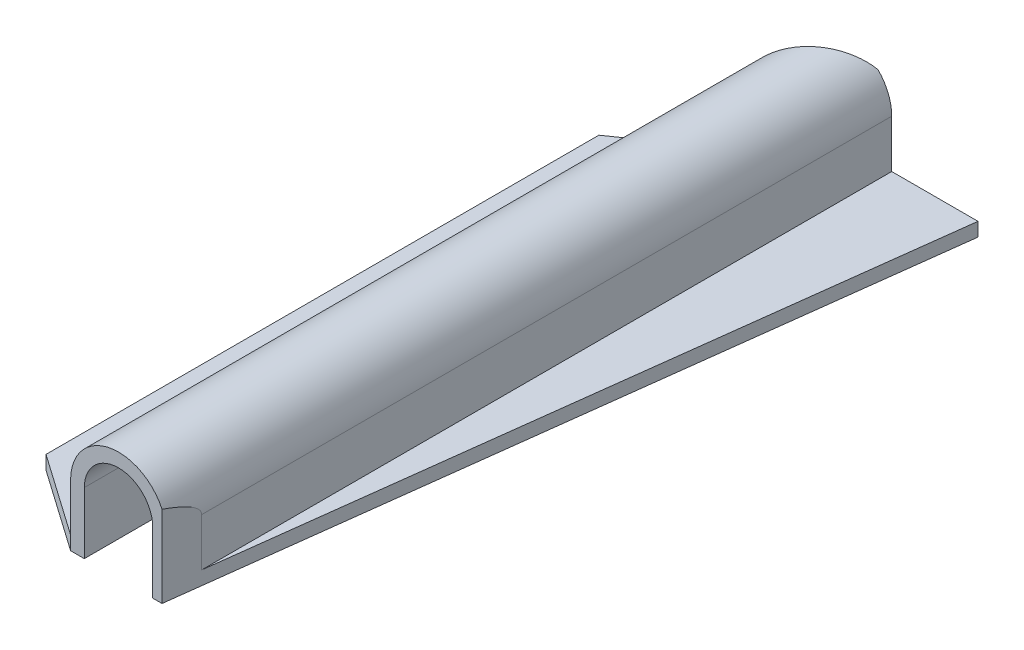
ISO-10303-21;
HEADER;
FILE_DESCRIPTION(('STEP AP214'),'2;1');
FILE_NAME('part.step','',(''),(''),'','','');
FILE_SCHEMA(('AUTOMOTIVE_DESIGN { 1 0 10303 214 1 1 1 1 }'));
ENDSEC;
DATA;
#1=APPLICATION_CONTEXT('core data for automotive mechanical design processes');
#2=APPLICATION_PROTOCOL_DEFINITION('international standard','automotive_design',2000,#1);
#3=PRODUCT_CONTEXT('',#1,'mechanical');
#4=PRODUCT('Part','Part','',(#3));
#5=PRODUCT_RELATED_PRODUCT_CATEGORY('part','',(#4));
#6=PRODUCT_DEFINITION_FORMATION('','',#4);
#7=PRODUCT_DEFINITION_CONTEXT('part definition',#1,'design');
#8=PRODUCT_DEFINITION('design','',#6,#7);
#9=PRODUCT_DEFINITION_SHAPE('','',#8);
#10=(LENGTH_UNIT() NAMED_UNIT(*) SI_UNIT(.MILLI.,.METRE.));
#11=(NAMED_UNIT(*) PLANE_ANGLE_UNIT() SI_UNIT($,.RADIAN.));
#12=(NAMED_UNIT(*) SI_UNIT($,.STERADIAN.) SOLID_ANGLE_UNIT());
#13=UNCERTAINTY_MEASURE_WITH_UNIT(LENGTH_MEASURE(1.E-05),#10,'distance_accuracy_value','');
#14=(GEOMETRIC_REPRESENTATION_CONTEXT(3) GLOBAL_UNCERTAINTY_ASSIGNED_CONTEXT((#13)) GLOBAL_UNIT_ASSIGNED_CONTEXT((#10,
#11,#12)) REPRESENTATION_CONTEXT('',''));
#15=CARTESIAN_POINT('',(0.,0.,0.));
#16=DIRECTION('',(0.,0.,1.));
#17=DIRECTION('',(1.,0.,0.));
#18=AXIS2_PLACEMENT_3D('',#15,#16,#17);
#19=CARTESIAN_POINT('',(0.,4.5,53.));
#20=DIRECTION('',(0.,0.,1.));
#21=DIRECTION('',(1.,0.,0.));
#22=AXIS2_PLACEMENT_3D('',#19,#20,#21);
#23=PLANE('',#22);
#24=DIRECTION('',(0.,1.,0.));
#25=VECTOR('',#24,1.);
#26=CARTESIAN_POINT('',(-3.5,0.,53.));
#27=LINE('',#26,#25);
#28=CARTESIAN_POINT('',(-3.5,1.,53.));
#29=VERTEX_POINT('',#28);
#30=CARTESIAN_POINT('',(-3.5,4.5,53.));
#31=VERTEX_POINT('',#30);
#32=EDGE_CURVE('E142',#29,#31,#27,.T.);
#33=ORIENTED_EDGE('',*,*,#32,.F.);
#34=DIRECTION('',(0.,-1.,0.));
#35=VECTOR('',#34,1.);
#36=CARTESIAN_POINT('',(-3.5,8.,53.));
#37=LINE('',#36,#35);
#38=CARTESIAN_POINT('',(-3.5,0.,53.));
#39=VERTEX_POINT('',#38);
#40=EDGE_CURVE('E129',#29,#39,#37,.T.);
#41=ORIENTED_EDGE('',*,*,#40,.T.);
#42=DIRECTION('',(1.,0.,0.));
#43=VECTOR('',#42,1.);
#44=CARTESIAN_POINT('',(-9.5,0.,53.));
#45=LINE('',#44,#43);
#46=CARTESIAN_POINT('',(-2.5,0.,53.));
#47=VERTEX_POINT('',#46);
#48=EDGE_CURVE('E138',#39,#47,#45,.T.);
#49=ORIENTED_EDGE('',*,*,#48,.T.);
#50=DIRECTION('',(0.,1.,0.));
#51=VECTOR('',#50,1.);
#52=CARTESIAN_POINT('',(-2.5,0.,53.));
#53=LINE('',#52,#51);
#54=CARTESIAN_POINT('',(-2.5,4.5,53.));
#55=VERTEX_POINT('',#54);
#56=EDGE_CURVE('E149',#47,#55,#53,.T.);
#57=ORIENTED_EDGE('',*,*,#56,.T.);
#58=CARTESIAN_POINT('',(0.,4.5,53.));
#59=DIRECTION('',(0.,0.,-1.));
#60=DIRECTION('',(-1.,0.,0.));
#61=AXIS2_PLACEMENT_3D('',#58,#59,#60);
#62=CIRCLE('',#61,2.5);
#63=CARTESIAN_POINT('',(2.5,4.5,53.));
#64=VERTEX_POINT('',#63);
#65=EDGE_CURVE('E151',#55,#64,#62,.T.);
#66=ORIENTED_EDGE('',*,*,#65,.T.);
#67=DIRECTION('',(0.,-1.,0.));
#68=VECTOR('',#67,1.);
#69=CARTESIAN_POINT('',(2.5,4.5,53.));
#70=LINE('',#69,#68);
#71=CARTESIAN_POINT('',(2.5,0.,53.));
#72=VERTEX_POINT('',#71);
#73=EDGE_CURVE('E158',#64,#72,#70,.T.);
#74=ORIENTED_EDGE('',*,*,#73,.T.);
#75=DIRECTION('',(1.,0.,0.));
#76=VECTOR('',#75,1.);
#77=CARTESIAN_POINT('',(2.5,0.,53.));
#78=LINE('',#77,#76);
#79=CARTESIAN_POINT('',(3.17775414458155,0.,53.));
#80=VERTEX_POINT('',#79);
#81=EDGE_CURVE('E176',#72,#80,#78,.T.);
#82=ORIENTED_EDGE('',*,*,#81,.T.);
#83=DIRECTION('',(0.,1.,0.));
#84=VECTOR('',#83,1.);
#85=CARTESIAN_POINT('',(3.17775414458155,4.5,53.));
#86=LINE('',#85,#84);
#87=CARTESIAN_POINT('',(3.17775414458155,5.96692828611176,53.));
#88=VERTEX_POINT('',#87);
#89=EDGE_CURVE('E11',#80,#88,#86,.T.);
#90=ORIENTED_EDGE('',*,*,#89,.T.);
#91=CARTESIAN_POINT('',(0.,4.5,53.));
#92=DIRECTION('',(0.,0.,1.));
#93=DIRECTION('',(1.,0.,0.));
#94=AXIS2_PLACEMENT_3D('',#91,#92,#93);
#95=CIRCLE('',#94,3.5);
#96=EDGE_CURVE('E153',#31,#88,#95,.F.);
#97=ORIENTED_EDGE('',*,*,#96,.F.);
#98=EDGE_LOOP('',(#33,#41,#49,#57,#66,#74,#82,#90,#97));
#99=FACE_BOUND('',#98,.T.);
#100=ADVANCED_FACE('F35',(#99),#23,.T.);
#101=CARTESIAN_POINT('',(-9.5,1.,53.));
#102=DIRECTION('',(0.,1.,0.));
#103=DIRECTION('',(0.,0.,1.));
#104=AXIS2_PLACEMENT_3D('',#101,#102,#103);
#105=PLANE('',#104);
#106=CARTESIAN_POINT('',(-7.,1.,28.6006226146291));
#107=DIRECTION('',(0.,1.,0.));
#108=DIRECTION('',(0.,0.,1.));
#109=AXIS2_PLACEMENT_3D('',#106,#107,#108);
#110=CIRCLE('',#109,1.1);
#111=CARTESIAN_POINT('',(-7.,1.,29.7006226146291));
#112=VERTEX_POINT('',#111);
#113=EDGE_CURVE('E257',#112,#112,#110,.T.);
#114=ORIENTED_EDGE('',*,*,#113,.F.);
#115=EDGE_LOOP('',(#114));
#116=FACE_BOUND('',#115,.T.);
#117=DIRECTION('',(0.,0.,-1.));
#118=VECTOR('',#117,1.);
#119=CARTESIAN_POINT('',(-9.5,1.,53.));
#120=LINE('',#119,#118);
#121=CARTESIAN_POINT('',(-9.5,1.,48.7987547707418));
#122=VERTEX_POINT('',#121);
#123=CARTESIAN_POINT('',(-9.5,1.,8.40249045851643));
#124=VERTEX_POINT('',#123);
#125=EDGE_CURVE('E188',#122,#124,#120,.T.);
#126=ORIENTED_EDGE('',*,*,#125,.F.);
#127=DIRECTION('',(0.819152044288995,0.,0.573576436351041));
#128=VECTOR('',#127,1.);
#129=CARTESIAN_POINT('',(-7.52606042997704,1.,50.1809221376423));
#130=LINE('',#129,#128);
#131=EDGE_CURVE('E254',#122,#29,#130,.T.);
#132=ORIENTED_EDGE('',*,*,#131,.T.);
#133=DIRECTION('',(0.,0.,-1.));
#134=VECTOR('',#133,1.);
#135=CARTESIAN_POINT('',(-3.5,1.,53.));
#136=LINE('',#135,#134);
#137=CARTESIAN_POINT('',(-3.5,1.,4.20124522925822));
#138=VERTEX_POINT('',#137);
#139=EDGE_CURVE('E190',#29,#138,#136,.T.);
#140=ORIENTED_EDGE('',*,*,#139,.T.);
#141=DIRECTION('',(-0.819152044288995,0.,0.573576436351042));
#142=VECTOR('',#141,1.);
#143=CARTESIAN_POINT('',(-30.4539753107805,1.,23.0746219265849));
#144=LINE('',#143,#142);
#145=EDGE_CURVE('E237',#138,#124,#144,.T.);
#146=ORIENTED_EDGE('',*,*,#145,.T.);
#147=EDGE_LOOP('',(#126,#132,#140,#146));
#148=FACE_BOUND('',#147,.T.);
#149=ADVANCED_FACE('F270',(#116,#148),#105,.T.);
#150=CARTESIAN_POINT('',(-9.5,0.,53.));
#151=DIRECTION('',(-1.,0.,0.));
#152=DIRECTION('',(0.,0.,1.));
#153=AXIS2_PLACEMENT_3D('',#150,#151,#152);
#154=PLANE('',#153);
#155=DIRECTION('',(0.,0.,-1.));
#156=VECTOR('',#155,1.);
#157=CARTESIAN_POINT('',(-9.5,0.,53.));
#158=LINE('',#157,#156);
#159=CARTESIAN_POINT('',(-9.5,0.,48.7987547707418));
#160=VERTEX_POINT('',#159);
#161=CARTESIAN_POINT('',(-9.5,0.,8.40249045851643));
#162=VERTEX_POINT('',#161);
#163=EDGE_CURVE('E186',#160,#162,#158,.T.);
#164=ORIENTED_EDGE('',*,*,#163,.F.);
#165=DIRECTION('',(0.,-1.,0.));
#166=VECTOR('',#165,1.);
#167=CARTESIAN_POINT('',(-9.5,8.,48.7987547707418));
#168=LINE('',#167,#166);
#169=EDGE_CURVE('E50',#122,#160,#168,.T.);
#170=ORIENTED_EDGE('',*,*,#169,.F.);
#171=ORIENTED_EDGE('',*,*,#125,.T.);
#172=DIRECTION('',(0.,-1.,0.));
#173=VECTOR('',#172,1.);
#174=CARTESIAN_POINT('',(-9.5,8.,8.40249045851643));
#175=LINE('',#174,#173);
#176=EDGE_CURVE('E216',#124,#162,#175,.T.);
#177=ORIENTED_EDGE('',*,*,#176,.T.);
#178=EDGE_LOOP('',(#164,#170,#171,#177));
#179=FACE_BOUND('',#178,.T.);
#180=ADVANCED_FACE('F273',(#179),#154,.T.);
#181=CARTESIAN_POINT('',(-9.5,0.,53.));
#182=DIRECTION('',(0.,1.,0.));
#183=DIRECTION('',(0.,0.,1.));
#184=AXIS2_PLACEMENT_3D('',#181,#182,#183);
#185=PLANE('',#184);
#186=CARTESIAN_POINT('',(-7.,0.,28.6006226146291));
#187=DIRECTION('',(0.,1.,0.));
#188=DIRECTION('',(0.,0.,1.));
#189=AXIS2_PLACEMENT_3D('',#186,#187,#188);
#190=CIRCLE('',#189,1.1);
#191=CARTESIAN_POINT('',(-7.,0.,29.7006226146291));
#192=VERTEX_POINT('',#191);
#193=EDGE_CURVE('E134',#192,#192,#190,.T.);
#194=ORIENTED_EDGE('',*,*,#193,.T.);
#195=EDGE_LOOP('',(#194));
#196=FACE_BOUND('',#195,.T.);
#197=DIRECTION('',(-0.819152044288995,0.,-0.573576436351041));
#198=VECTOR('',#197,1.);
#199=CARTESIAN_POINT('',(-3.5,0.,53.));
#200=LINE('',#199,#198);
#201=EDGE_CURVE('E126',#39,#160,#200,.T.);
#202=ORIENTED_EDGE('',*,*,#201,.T.);
#203=ORIENTED_EDGE('',*,*,#163,.T.);
#204=DIRECTION('',(0.819152044288995,0.,-0.573576436351042));
#205=VECTOR('',#204,1.);
#206=CARTESIAN_POINT('',(2.5,0.,0.));
#207=LINE('',#206,#205);
#208=CARTESIAN_POINT('',(-2.5,0.,3.50103769104851));
#209=VERTEX_POINT('',#208);
#210=EDGE_CURVE('E243',#162,#209,#207,.T.);
#211=ORIENTED_EDGE('',*,*,#210,.T.);
#212=DIRECTION('',(0.,0.,-1.));
#213=VECTOR('',#212,1.);
#214=CARTESIAN_POINT('',(-2.5,0.,53.));
#215=LINE('',#214,#213);
#216=EDGE_CURVE('E147',#47,#209,#215,.T.);
#217=ORIENTED_EDGE('',*,*,#216,.F.);
#218=ORIENTED_EDGE('',*,*,#48,.F.);
#219=EDGE_LOOP('',(#202,#203,#211,#217,#218));
#220=FACE_BOUND('',#219,.T.);
#221=ADVANCED_FACE('F144',(#196,#220),#185,.F.);
#222=CARTESIAN_POINT('',(0.,4.5,53.));
#223=DIRECTION('',(0.,0.,-1.));
#224=DIRECTION('',(-1.,0.,0.));
#225=AXIS2_PLACEMENT_3D('',#222,#223,#224);
#226=CYLINDRICAL_SURFACE('',#225,3.5);
#227=ORIENTED_EDGE('',*,*,#96,.T.);
#228=CARTESIAN_POINT('',(0.,4.5,78.4213081113825));
#229=DIRECTION('',(0.992277441308992,0.,0.124038217776943));
#230=DIRECTION('',(0.124038217776943,0.,-0.992277441308992));
#231=AXIS2_PLACEMENT_3D('',#228,#229,#230);
#232=ELLIPSE('',#231,28.2171097160879,3.5);
#233=CARTESIAN_POINT('',(3.5,4.5,50.4221066811677));
#234=VERTEX_POINT('',#233);
#235=EDGE_CURVE('E58',#88,#234,#232,.F.);
#236=ORIENTED_EDGE('',*,*,#235,.T.);
#237=DIRECTION('',(0.,0.,-1.));
#238=VECTOR('',#237,1.);
#239=CARTESIAN_POINT('',(3.5,4.5,53.));
#240=LINE('',#239,#238);
#241=CARTESIAN_POINT('',(3.5,4.5,0.));
#242=VERTEX_POINT('',#241);
#243=EDGE_CURVE('E196',#234,#242,#240,.T.);
#244=ORIENTED_EDGE('',*,*,#243,.T.);
#245=CARTESIAN_POINT('',(0.,4.5,0.));
#246=DIRECTION('',(0.,0.,1.));
#247=DIRECTION('',(1.,0.,0.));
#248=AXIS2_PLACEMENT_3D('',#245,#246,#247);
#249=CIRCLE('',#248,3.5);
#250=CARTESIAN_POINT('',(2.5,6.94948974278318,0.));
#251=VERTEX_POINT('',#250);
#252=EDGE_CURVE('E171',#251,#242,#249,.F.);
#253=ORIENTED_EDGE('',*,*,#252,.F.);
#254=CARTESIAN_POINT('',(0.,4.5,1.75051884552425));
#255=DIRECTION('',(-0.573576436351042,0.,-0.819152044288995));
#256=DIRECTION('',(0.819152044288995,0.,-0.573576436351042));
#257=AXIS2_PLACEMENT_3D('',#254,#255,#256);
#258=ELLIPSE('',#257,4.27271106066508,3.5);
#259=CARTESIAN_POINT('',(-3.5,4.5,4.20124522925821));
#260=VERTEX_POINT('',#259);
#261=EDGE_CURVE('E165',#251,#260,#258,.F.);
#262=ORIENTED_EDGE('',*,*,#261,.T.);
#263=DIRECTION('',(0.,0.,-1.));
#264=VECTOR('',#263,1.);
#265=CARTESIAN_POINT('',(-3.5,4.5,53.));
#266=LINE('',#265,#264);
#267=EDGE_CURVE('E193',#31,#260,#266,.T.);
#268=ORIENTED_EDGE('',*,*,#267,.F.);
#269=EDGE_LOOP('',(#227,#236,#244,#253,#262,#268));
#270=FACE_BOUND('',#269,.T.);
#271=ADVANCED_FACE('F303',(#270),#226,.T.);
#272=CARTESIAN_POINT('',(0.,4.5,0.));
#273=DIRECTION('',(0.,0.,1.));
#274=DIRECTION('',(1.,0.,0.));
#275=AXIS2_PLACEMENT_3D('',#272,#273,#274);
#276=PLANE('',#275);
#277=DIRECTION('',(0.,1.,0.));
#278=VECTOR('',#277,1.);
#279=CARTESIAN_POINT('',(9.80294309728579,4.5,0.));
#280=LINE('',#279,#278);
#281=CARTESIAN_POINT('',(9.80294309728579,0.,0.));
#282=VERTEX_POINT('',#281);
#283=CARTESIAN_POINT('',(9.80294309728579,1.,0.));
#284=VERTEX_POINT('',#283);
#285=EDGE_CURVE('E224',#282,#284,#280,.T.);
#286=ORIENTED_EDGE('',*,*,#285,.F.);
#287=DIRECTION('',(1.,0.,0.));
#288=VECTOR('',#287,1.);
#289=CARTESIAN_POINT('',(2.5,0.,0.));
#290=LINE('',#289,#288);
#291=CARTESIAN_POINT('',(2.5,0.,0.));
#292=VERTEX_POINT('',#291);
#293=EDGE_CURVE('E161',#292,#282,#290,.T.);
#294=ORIENTED_EDGE('',*,*,#293,.F.);
#295=DIRECTION('',(0.,-1.,0.));
#296=VECTOR('',#295,1.);
#297=CARTESIAN_POINT('',(2.5,4.5,0.));
#298=LINE('',#297,#296);
#299=CARTESIAN_POINT('',(2.5,4.5,0.));
#300=VERTEX_POINT('',#299);
#301=EDGE_CURVE('E174',#300,#292,#298,.T.);
#302=ORIENTED_EDGE('',*,*,#301,.F.);
#303=DIRECTION('',(0.,-1.,0.));
#304=VECTOR('',#303,1.);
#305=CARTESIAN_POINT('',(2.5,4.5,0.));
#306=LINE('',#305,#304);
#307=EDGE_CURVE('E43',#251,#300,#306,.T.);
#308=ORIENTED_EDGE('',*,*,#307,.F.);
#309=ORIENTED_EDGE('',*,*,#252,.T.);
#310=DIRECTION('',(0.,1.,0.));
#311=VECTOR('',#310,1.);
#312=CARTESIAN_POINT('',(3.5,4.5,0.));
#313=LINE('',#312,#311);
#314=CARTESIAN_POINT('',(3.5,1.,0.));
#315=VERTEX_POINT('',#314);
#316=EDGE_CURVE('E168',#242,#315,#313,.F.);
#317=ORIENTED_EDGE('',*,*,#316,.T.);
#318=DIRECTION('',(1.,0.,0.));
#319=VECTOR('',#318,1.);
#320=CARTESIAN_POINT('',(2.5,1.,0.));
#321=LINE('',#320,#319);
#322=EDGE_CURVE('E164',#315,#284,#321,.T.);
#323=ORIENTED_EDGE('',*,*,#322,.T.);
#324=EDGE_LOOP('',(#286,#294,#302,#308,#309,#317,#323));
#325=FACE_BOUND('',#324,.T.);
#326=ADVANCED_FACE('F223',(#325),#276,.F.);
#327=CARTESIAN_POINT('',(2.5,0.,53.));
#328=DIRECTION('',(0.,1.,0.));
#329=DIRECTION('',(0.,0.,1.));
#330=AXIS2_PLACEMENT_3D('',#327,#328,#329);
#331=PLANE('',#330);
#332=DIRECTION('',(-0.124038217776943,0.,0.992277441308992));
#333=VECTOR('',#332,1.);
#334=CARTESIAN_POINT('',(17.5,0.,-61.5746990396917));
#335=LINE('',#334,#333);
#336=EDGE_CURVE('E228',#282,#80,#335,.T.);
#337=ORIENTED_EDGE('',*,*,#336,.T.);
#338=ORIENTED_EDGE('',*,*,#81,.F.);
#339=DIRECTION('',(0.,0.,-1.));
#340=VECTOR('',#339,1.);
#341=CARTESIAN_POINT('',(2.5,0.,53.));
#342=LINE('',#341,#340);
#343=EDGE_CURVE('E160',#72,#292,#342,.T.);
#344=ORIENTED_EDGE('',*,*,#343,.T.);
#345=ORIENTED_EDGE('',*,*,#293,.T.);
#346=EDGE_LOOP('',(#337,#338,#344,#345));
#347=FACE_BOUND('',#346,.T.);
#348=ADVANCED_FACE('F37',(#347),#331,.F.);
#349=CARTESIAN_POINT('',(2.5,1.,53.));
#350=DIRECTION('',(0.,1.,0.));
#351=DIRECTION('',(0.,0.,1.));
#352=AXIS2_PLACEMENT_3D('',#349,#350,#351);
#353=PLANE('',#352);
#354=DIRECTION('',(0.,0.,-1.));
#355=VECTOR('',#354,1.);
#356=CARTESIAN_POINT('',(3.5,1.,53.));
#357=LINE('',#356,#355);
#358=CARTESIAN_POINT('',(3.5,1.,50.4221066811677));
#359=VERTEX_POINT('',#358);
#360=EDGE_CURVE('E198',#359,#315,#357,.T.);
#361=ORIENTED_EDGE('',*,*,#360,.F.);
#362=DIRECTION('',(0.124038217776943,0.,-0.992277441308992));
#363=VECTOR('',#362,1.);
#364=CARTESIAN_POINT('',(3.16732657210487,1.,53.0834182006293));
#365=LINE('',#364,#363);
#366=EDGE_CURVE('E247',#359,#284,#365,.T.);
#367=ORIENTED_EDGE('',*,*,#366,.T.);
#368=ORIENTED_EDGE('',*,*,#322,.F.);
#369=EDGE_LOOP('',(#361,#367,#368));
#370=FACE_BOUND('',#369,.T.);
#371=ADVANCED_FACE('F323',(#370),#353,.T.);
#372=CARTESIAN_POINT('',(3.5,4.5,53.));
#373=DIRECTION('',(1.,0.,0.));
#374=DIRECTION('',(0.,0.,-1.));
#375=AXIS2_PLACEMENT_3D('',#372,#373,#374);
#376=PLANE('',#375);
#377=ORIENTED_EDGE('',*,*,#243,.F.);
#378=DIRECTION('',(0.,-1.,0.));
#379=VECTOR('',#378,1.);
#380=CARTESIAN_POINT('',(3.5,4.5,50.4221066811677));
#381=LINE('',#380,#379);
#382=EDGE_CURVE('E250',#234,#359,#381,.T.);
#383=ORIENTED_EDGE('',*,*,#382,.T.);
#384=ORIENTED_EDGE('',*,*,#360,.T.);
#385=ORIENTED_EDGE('',*,*,#316,.F.);
#386=EDGE_LOOP('',(#377,#383,#384,#385));
#387=FACE_BOUND('',#386,.T.);
#388=ADVANCED_FACE('F290',(#387),#376,.T.);
#389=CARTESIAN_POINT('',(-3.5,0.,53.));
#390=DIRECTION('',(-1.,0.,0.));
#391=DIRECTION('',(0.,0.,1.));
#392=AXIS2_PLACEMENT_3D('',#389,#390,#391);
#393=PLANE('',#392);
#394=ORIENTED_EDGE('',*,*,#267,.T.);
#395=DIRECTION('',(0.,-1.,0.));
#396=VECTOR('',#395,1.);
#397=CARTESIAN_POINT('',(-3.5,0.,4.20124522925821));
#398=LINE('',#397,#396);
#399=EDGE_CURVE('E234',#260,#138,#398,.T.);
#400=ORIENTED_EDGE('',*,*,#399,.T.);
#401=ORIENTED_EDGE('',*,*,#139,.F.);
#402=ORIENTED_EDGE('',*,*,#32,.T.);
#403=EDGE_LOOP('',(#394,#400,#401,#402));
#404=FACE_BOUND('',#403,.T.);
#405=ADVANCED_FACE('F283',(#404),#393,.T.);
#406=CARTESIAN_POINT('',(-2.5,0.,53.));
#407=DIRECTION('',(-1.,0.,0.));
#408=DIRECTION('',(0.,0.,1.));
#409=AXIS2_PLACEMENT_3D('',#406,#407,#408);
#410=PLANE('',#409);
#411=DIRECTION('',(0.,-1.,0.));
#412=VECTOR('',#411,1.);
#413=CARTESIAN_POINT('',(-2.5,0.,3.50103769104851));
#414=LINE('',#413,#412);
#415=CARTESIAN_POINT('',(-2.5,4.5,3.50103769104851));
#416=VERTEX_POINT('',#415);
#417=EDGE_CURVE('E215',#416,#209,#414,.T.);
#418=ORIENTED_EDGE('',*,*,#417,.F.);
#419=DIRECTION('',(0.,0.,-1.));
#420=VECTOR('',#419,1.);
#421=CARTESIAN_POINT('',(-2.5,4.5,53.));
#422=LINE('',#421,#420);
#423=EDGE_CURVE('E182',#55,#416,#422,.T.);
#424=ORIENTED_EDGE('',*,*,#423,.F.);
#425=ORIENTED_EDGE('',*,*,#56,.F.);
#426=ORIENTED_EDGE('',*,*,#216,.T.);
#427=EDGE_LOOP('',(#418,#424,#425,#426));
#428=FACE_BOUND('',#427,.T.);
#429=ADVANCED_FACE('F281',(#428),#410,.F.);
#430=CARTESIAN_POINT('',(0.,4.5,53.));
#431=DIRECTION('',(0.,0.,-1.));
#432=DIRECTION('',(-1.,0.,0.));
#433=AXIS2_PLACEMENT_3D('',#430,#431,#432);
#434=CYLINDRICAL_SURFACE('',#433,2.5);
#435=CARTESIAN_POINT('',(0.,4.5,1.75051884552425));
#436=DIRECTION('',(-0.573576436351042,0.,-0.819152044288995));
#437=DIRECTION('',(0.819152044288995,0.,-0.573576436351042));
#438=AXIS2_PLACEMENT_3D('',#435,#436,#437);
#439=ELLIPSE('',#438,3.05193647190363,2.5);
#440=EDGE_CURVE('E203',#300,#416,#439,.F.);
#441=ORIENTED_EDGE('',*,*,#440,.F.);
#442=DIRECTION('',(0.,0.,-1.));
#443=VECTOR('',#442,1.);
#444=CARTESIAN_POINT('',(2.5,4.5,53.));
#445=LINE('',#444,#443);
#446=EDGE_CURVE('E179',#64,#300,#445,.T.);
#447=ORIENTED_EDGE('',*,*,#446,.F.);
#448=ORIENTED_EDGE('',*,*,#65,.F.);
#449=ORIENTED_EDGE('',*,*,#423,.T.);
#450=EDGE_LOOP('',(#441,#447,#448,#449));
#451=FACE_BOUND('',#450,.T.);
#452=ADVANCED_FACE('F211',(#451),#434,.F.);
#453=CARTESIAN_POINT('',(2.5,4.5,53.));
#454=DIRECTION('',(1.,0.,0.));
#455=DIRECTION('',(0.,0.,-1.));
#456=AXIS2_PLACEMENT_3D('',#453,#454,#455);
#457=PLANE('',#456);
#458=ORIENTED_EDGE('',*,*,#301,.T.);
#459=ORIENTED_EDGE('',*,*,#343,.F.);
#460=ORIENTED_EDGE('',*,*,#73,.F.);
#461=ORIENTED_EDGE('',*,*,#446,.T.);
#462=EDGE_LOOP('',(#458,#459,#460,#461));
#463=FACE_BOUND('',#462,.T.);
#464=ADVANCED_FACE('F219',(#463),#457,.F.);
#465=CARTESIAN_POINT('',(2.5,8.,0.));
#466=DIRECTION('',(-0.573576436351042,0.,-0.819152044288995));
#467=DIRECTION('',(-0.819152044288995,0.,0.573576436351042));
#468=AXIS2_PLACEMENT_3D('',#465,#466,#467);
#469=PLANE('',#468);
#470=ORIENTED_EDGE('',*,*,#307,.T.);
#471=ORIENTED_EDGE('',*,*,#440,.T.);
#472=ORIENTED_EDGE('',*,*,#417,.T.);
#473=ORIENTED_EDGE('',*,*,#210,.F.);
#474=ORIENTED_EDGE('',*,*,#176,.F.);
#475=ORIENTED_EDGE('',*,*,#145,.F.);
#476=ORIENTED_EDGE('',*,*,#399,.F.);
#477=ORIENTED_EDGE('',*,*,#261,.F.);
#478=EDGE_LOOP('',(#470,#471,#472,#473,#474,#475,#476,#477));
#479=FACE_BOUND('',#478,.T.);
#480=ADVANCED_FACE('F202',(#479),#469,.T.);
#481=CARTESIAN_POINT('',(17.5,8.,-61.5746990396917));
#482=DIRECTION('',(0.992277441308992,0.,0.124038217776943));
#483=DIRECTION('',(0.124038217776943,0.,-0.992277441308992));
#484=AXIS2_PLACEMENT_3D('',#481,#482,#483);
#485=PLANE('',#484);
#486=ORIENTED_EDGE('',*,*,#89,.F.);
#487=ORIENTED_EDGE('',*,*,#336,.F.);
#488=ORIENTED_EDGE('',*,*,#285,.T.);
#489=ORIENTED_EDGE('',*,*,#366,.F.);
#490=ORIENTED_EDGE('',*,*,#382,.F.);
#491=ORIENTED_EDGE('',*,*,#235,.F.);
#492=EDGE_LOOP('',(#486,#487,#488,#489,#490,#491));
#493=FACE_BOUND('',#492,.T.);
#494=ADVANCED_FACE('F308',(#493),#485,.T.);
#495=CARTESIAN_POINT('',(-3.5,8.,53.));
#496=DIRECTION('',(-0.573576436351041,0.,0.819152044288995));
#497=DIRECTION('',(0.819152044288995,0.,0.573576436351041));
#498=AXIS2_PLACEMENT_3D('',#495,#496,#497);
#499=PLANE('',#498);
#500=ORIENTED_EDGE('',*,*,#169,.T.);
#501=ORIENTED_EDGE('',*,*,#201,.F.);
#502=ORIENTED_EDGE('',*,*,#40,.F.);
#503=ORIENTED_EDGE('',*,*,#131,.F.);
#504=EDGE_LOOP('',(#500,#501,#502,#503));
#505=FACE_BOUND('',#504,.T.);
#506=ADVANCED_FACE('F128',(#505),#499,.T.);
#507=CARTESIAN_POINT('',(-7.,0.,28.6006226146291));
#508=DIRECTION('',(0.,1.,0.));
#509=DIRECTION('',(0.,0.,1.));
#510=AXIS2_PLACEMENT_3D('',#507,#508,#509);
#511=CYLINDRICAL_SURFACE('',#510,1.1);
#512=ORIENTED_EDGE('',*,*,#193,.F.);
#513=EDGE_LOOP('',(#512));
#514=FACE_BOUND('',#513,.T.);
#515=ORIENTED_EDGE('',*,*,#113,.T.);
#516=EDGE_LOOP('',(#515));
#517=FACE_BOUND('',#516,.T.);
#518=ADVANCED_FACE('F264',(#514,#517),#511,.F.);
#519=CLOSED_SHELL('',(#100,#149,#180,#221,#271,#326,#348,#371,#388,#405,#429,#452,#464,#480,
#494,#506,#518));
#520=MANIFOLD_SOLID_BREP('B2',#519);
#521=ADVANCED_BREP_SHAPE_REPRESENTATION('',(#18,#520),#14);
#522=SHAPE_DEFINITION_REPRESENTATION(#9,#521);
ENDSEC;
END-ISO-10303-21;
